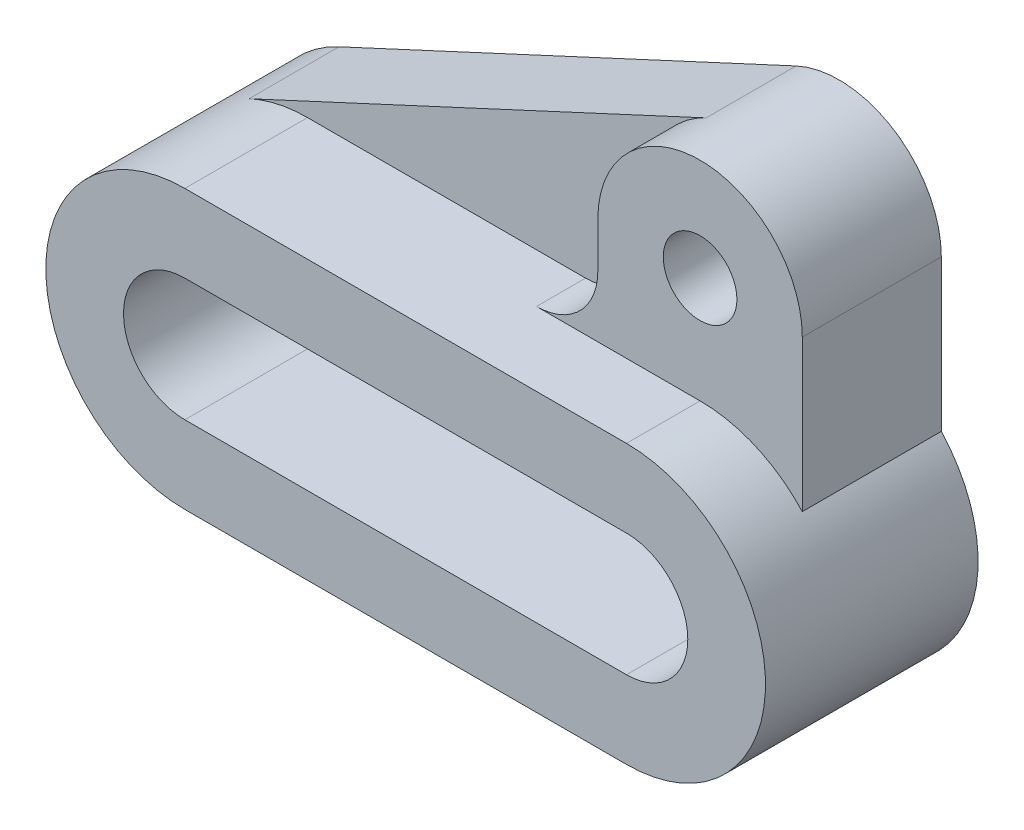
ISO-10303-21;
HEADER;
FILE_DESCRIPTION(('STEP AP214'),'2;1');
FILE_NAME('part.step','',(''),(''),'','','');
FILE_SCHEMA(('AUTOMOTIVE_DESIGN { 1 0 10303 214 1 1 1 1 }'));
ENDSEC;
DATA;
#1=APPLICATION_CONTEXT('core data for automotive mechanical design processes');
#2=APPLICATION_PROTOCOL_DEFINITION('international standard','automotive_design',2000,#1);
#3=PRODUCT_CONTEXT('',#1,'mechanical');
#4=PRODUCT('Part','Part','',(#3));
#5=PRODUCT_RELATED_PRODUCT_CATEGORY('part','',(#4));
#6=PRODUCT_DEFINITION_FORMATION('','',#4);
#7=PRODUCT_DEFINITION_CONTEXT('part definition',#1,'design');
#8=PRODUCT_DEFINITION('design','',#6,#7);
#9=PRODUCT_DEFINITION_SHAPE('','',#8);
#10=(LENGTH_UNIT() NAMED_UNIT(*) SI_UNIT(.MILLI.,.METRE.));
#11=(NAMED_UNIT(*) PLANE_ANGLE_UNIT() SI_UNIT($,.RADIAN.));
#12=(NAMED_UNIT(*) SI_UNIT($,.STERADIAN.) SOLID_ANGLE_UNIT());
#13=UNCERTAINTY_MEASURE_WITH_UNIT(LENGTH_MEASURE(1.E-05),#10,'distance_accuracy_value','');
#14=(GEOMETRIC_REPRESENTATION_CONTEXT(3) GLOBAL_UNCERTAINTY_ASSIGNED_CONTEXT((#13)) GLOBAL_UNIT_ASSIGNED_CONTEXT((#10,
#11,#12)) REPRESENTATION_CONTEXT('',''));
#15=CARTESIAN_POINT('',(0.,0.,0.));
#16=DIRECTION('',(0.,0.,1.));
#17=DIRECTION('',(1.,0.,0.));
#18=AXIS2_PLACEMENT_3D('',#15,#16,#17);
#19=CARTESIAN_POINT('',(-54.,34.,-26.));
#20=DIRECTION('',(0.,1.,0.));
#21=DIRECTION('',(-1.,0.,0.));
#22=AXIS2_PLACEMENT_3D('',#19,#20,#21);
#23=PLANE('',#22);
#24=DIRECTION('',(0.,0.,-1.));
#25=VECTOR('',#24,1.);
#26=CARTESIAN_POINT('',(14.,34.,8.));
#27=LINE('',#26,#25);
#28=CARTESIAN_POINT('',(14.,34.,8.));
#29=VERTEX_POINT('',#28);
#30=CARTESIAN_POINT('',(14.,34.,-4.));
#31=VERTEX_POINT('',#30);
#32=EDGE_CURVE('E193',#29,#31,#27,.T.);
#33=ORIENTED_EDGE('',*,*,#32,.T.);
#34=DIRECTION('',(-1.,0.,0.));
#35=VECTOR('',#34,1.);
#36=CARTESIAN_POINT('',(14.,34.,-4.));
#37=LINE('',#36,#35);
#38=CARTESIAN_POINT('',(-54.,34.,-4.00000000000001));
#39=VERTEX_POINT('',#38);
#40=EDGE_CURVE('E299',#31,#39,#37,.T.);
#41=ORIENTED_EDGE('',*,*,#40,.T.);
#42=DIRECTION('',(0.,0.,1.));
#43=VECTOR('',#42,1.);
#44=CARTESIAN_POINT('',(-54.,34.,-26.));
#45=LINE('',#44,#43);
#46=CARTESIAN_POINT('',(-54.,34.,26.));
#47=VERTEX_POINT('',#46);
#48=EDGE_CURVE('E11',#39,#47,#45,.T.);
#49=ORIENTED_EDGE('',*,*,#48,.T.);
#50=DIRECTION('',(-1.,0.,0.));
#51=VECTOR('',#50,1.);
#52=CARTESIAN_POINT('',(-54.,34.,26.));
#53=LINE('',#52,#51);
#54=CARTESIAN_POINT('',(54.,34.,26.));
#55=VERTEX_POINT('',#54);
#56=EDGE_CURVE('E239',#55,#47,#53,.T.);
#57=ORIENTED_EDGE('',*,*,#56,.F.);
#58=DIRECTION('',(0.,0.,1.));
#59=VECTOR('',#58,1.);
#60=CARTESIAN_POINT('',(54.,34.,-26.));
#61=LINE('',#60,#59);
#62=CARTESIAN_POINT('',(54.,34.,7.99999999999999));
#63=VERTEX_POINT('',#62);
#64=EDGE_CURVE('E55',#63,#55,#61,.T.);
#65=ORIENTED_EDGE('',*,*,#64,.F.);
#66=DIRECTION('',(-1.,0.,0.));
#67=VECTOR('',#66,1.);
#68=CARTESIAN_POINT('',(54.,34.,8.));
#69=LINE('',#68,#67);
#70=EDGE_CURVE('E190',#63,#29,#69,.T.);
#71=ORIENTED_EDGE('',*,*,#70,.T.);
#72=EDGE_LOOP('',(#33,#41,#49,#57,#65,#71));
#73=FACE_BOUND('',#72,.T.);
#74=ADVANCED_FACE('F45',(#73),#23,.T.);
#75=CARTESIAN_POINT('',(-54.,0.,-26.));
#76=DIRECTION('',(0.,0.,1.));
#77=DIRECTION('',(1.,0.,0.));
#78=AXIS2_PLACEMENT_3D('',#75,#76,#77);
#79=CYLINDRICAL_SURFACE('',#78,34.);
#80=CARTESIAN_POINT('',(-54.,0.,-4.));
#81=DIRECTION('',(0.,0.,1.));
#82=DIRECTION('',(-1.,0.,0.));
#83=AXIS2_PLACEMENT_3D('',#80,#81,#82);
#84=CIRCLE('',#83,34.);
#85=CARTESIAN_POINT('',(-68.3028960954962,30.8452129718931,-4.));
#86=VERTEX_POINT('',#85);
#87=EDGE_CURVE('E63',#39,#86,#84,.T.);
#88=ORIENTED_EDGE('',*,*,#87,.T.);
#89=DIRECTION('',(0.,0.,-1.));
#90=VECTOR('',#89,1.);
#91=CARTESIAN_POINT('',(-68.3028960954962,30.8452129718931,-4.));
#92=LINE('',#91,#90);
#93=CARTESIAN_POINT('',(-68.3028960954962,30.8452129718931,-26.));
#94=VERTEX_POINT('',#93);
#95=EDGE_CURVE('E67',#86,#94,#92,.T.);
#96=ORIENTED_EDGE('',*,*,#95,.T.);
#97=CARTESIAN_POINT('',(-54.,0.,-26.));
#98=DIRECTION('',(0.,0.,1.));
#99=DIRECTION('',(1.,0.,0.));
#100=AXIS2_PLACEMENT_3D('',#97,#98,#99);
#101=CIRCLE('',#100,34.);
#102=CARTESIAN_POINT('',(-54.,-34.,-26.));
#103=VERTEX_POINT('',#102);
#104=EDGE_CURVE('E263',#94,#103,#101,.T.);
#105=ORIENTED_EDGE('',*,*,#104,.T.);
#106=DIRECTION('',(0.,0.,1.));
#107=VECTOR('',#106,1.);
#108=CARTESIAN_POINT('',(-54.,-34.,-26.));
#109=LINE('',#108,#107);
#110=CARTESIAN_POINT('',(-54.,-34.,26.));
#111=VERTEX_POINT('',#110);
#112=EDGE_CURVE('E49',#103,#111,#109,.T.);
#113=ORIENTED_EDGE('',*,*,#112,.T.);
#114=CARTESIAN_POINT('',(-54.,0.,26.));
#115=DIRECTION('',(0.,0.,1.));
#116=DIRECTION('',(1.,0.,0.));
#117=AXIS2_PLACEMENT_3D('',#114,#115,#116);
#118=CIRCLE('',#117,34.);
#119=EDGE_CURVE('E227',#47,#111,#118,.T.);
#120=ORIENTED_EDGE('',*,*,#119,.F.);
#121=ORIENTED_EDGE('',*,*,#48,.F.);
#122=EDGE_LOOP('',(#88,#96,#105,#113,#120,#121));
#123=FACE_BOUND('',#122,.T.);
#124=ADVANCED_FACE('F47',(#123),#79,.T.);
#125=CARTESIAN_POINT('',(54.,60.,8.));
#126=DIRECTION('',(0.,0.,-1.));
#127=DIRECTION('',(-1.,0.,0.));
#128=AXIS2_PLACEMENT_3D('',#125,#126,#127);
#129=CYLINDRICAL_SURFACE('',#128,25.);
#130=CARTESIAN_POINT('',(54.,60.,-26.));
#131=DIRECTION('',(0.,0.,-1.));
#132=DIRECTION('',(-1.,0.,0.));
#133=AXIS2_PLACEMENT_3D('',#130,#131,#132);
#134=CIRCLE('',#133,25.);
#135=CARTESIAN_POINT('',(43.4831646356646,82.6803036558037,-26.));
#136=VERTEX_POINT('',#135);
#137=CARTESIAN_POINT('',(79.,60.,-26.));
#138=VERTEX_POINT('',#137);
#139=EDGE_CURVE('E196',#136,#138,#134,.T.);
#140=ORIENTED_EDGE('',*,*,#139,.F.);
#141=DIRECTION('',(0.,0.,-1.));
#142=VECTOR('',#141,1.);
#143=CARTESIAN_POINT('',(43.4831646356646,82.6803036558037,-4.));
#144=LINE('',#143,#142);
#145=CARTESIAN_POINT('',(43.4831646356646,82.6803036558037,-4.));
#146=VERTEX_POINT('',#145);
#147=EDGE_CURVE('E326',#146,#136,#144,.T.);
#148=ORIENTED_EDGE('',*,*,#147,.F.);
#149=CARTESIAN_POINT('',(54.,60.,-4.));
#150=DIRECTION('',(0.,0.,1.));
#151=DIRECTION('',(-1.,0.,0.));
#152=AXIS2_PLACEMENT_3D('',#149,#150,#151);
#153=CIRCLE('',#152,25.);
#154=CARTESIAN_POINT('',(29.,60.,-4.));
#155=VERTEX_POINT('',#154);
#156=EDGE_CURVE('E311',#146,#155,#153,.T.);
#157=ORIENTED_EDGE('',*,*,#156,.T.);
#158=DIRECTION('',(0.,0.,-1.));
#159=VECTOR('',#158,1.);
#160=CARTESIAN_POINT('',(29.,60.,8.));
#161=LINE('',#160,#159);
#162=CARTESIAN_POINT('',(29.,60.,8.));
#163=VERTEX_POINT('',#162);
#164=EDGE_CURVE('E165',#163,#155,#161,.T.);
#165=ORIENTED_EDGE('',*,*,#164,.F.);
#166=CARTESIAN_POINT('',(54.,60.,8.));
#167=DIRECTION('',(0.,0.,-1.));
#168=DIRECTION('',(-1.,0.,0.));
#169=AXIS2_PLACEMENT_3D('',#166,#167,#168);
#170=CIRCLE('',#169,25.);
#171=CARTESIAN_POINT('',(79.,60.,8.));
#172=VERTEX_POINT('',#171);
#173=EDGE_CURVE('E171',#163,#172,#170,.T.);
#174=ORIENTED_EDGE('',*,*,#173,.T.);
#175=DIRECTION('',(0.,0.,-1.));
#176=VECTOR('',#175,1.);
#177=CARTESIAN_POINT('',(79.,60.,8.));
#178=LINE('',#177,#176);
#179=EDGE_CURVE('E154',#172,#138,#178,.T.);
#180=ORIENTED_EDGE('',*,*,#179,.T.);
#181=EDGE_LOOP('',(#140,#148,#157,#165,#174,#180));
#182=FACE_BOUND('',#181,.T.);
#183=ADVANCED_FACE('F176',(#182),#129,.T.);
#184=CARTESIAN_POINT('',(29.,60.,8.));
#185=DIRECTION('',(1.,0.,0.));
#186=DIRECTION('',(0.,0.,-1.));
#187=AXIS2_PLACEMENT_3D('',#184,#185,#186);
#188=PLANE('',#187);
#189=DIRECTION('',(0.,-1.,0.));
#190=VECTOR('',#189,1.);
#191=CARTESIAN_POINT('',(29.,60.,-4.));
#192=LINE('',#191,#190);
#193=CARTESIAN_POINT('',(29.,49.,-4.));
#194=VERTEX_POINT('',#193);
#195=EDGE_CURVE('E319',#155,#194,#192,.T.);
#196=ORIENTED_EDGE('',*,*,#195,.T.);
#197=DIRECTION('',(0.,0.,-1.));
#198=VECTOR('',#197,1.);
#199=CARTESIAN_POINT('',(29.,49.,8.));
#200=LINE('',#199,#198);
#201=CARTESIAN_POINT('',(29.,49.,8.));
#202=VERTEX_POINT('',#201);
#203=EDGE_CURVE('E203',#202,#194,#200,.T.);
#204=ORIENTED_EDGE('',*,*,#203,.F.);
#205=DIRECTION('',(0.,-1.,0.));
#206=VECTOR('',#205,1.);
#207=CARTESIAN_POINT('',(29.,60.,8.));
#208=LINE('',#207,#206);
#209=EDGE_CURVE('E180',#163,#202,#208,.T.);
#210=ORIENTED_EDGE('',*,*,#209,.F.);
#211=ORIENTED_EDGE('',*,*,#164,.T.);
#212=EDGE_LOOP('',(#196,#204,#210,#211));
#213=FACE_BOUND('',#212,.T.);
#214=ADVANCED_FACE('F362',(#213),#188,.F.);
#215=CARTESIAN_POINT('',(14.,49.,8.));
#216=DIRECTION('',(0.,0.,-1.));
#217=DIRECTION('',(-1.,0.,0.));
#218=AXIS2_PLACEMENT_3D('',#215,#216,#217);
#219=CYLINDRICAL_SURFACE('',#218,15.);
#220=CARTESIAN_POINT('',(14.,49.,-4.));
#221=DIRECTION('',(0.,0.,-1.));
#222=DIRECTION('',(-1.,0.,0.));
#223=AXIS2_PLACEMENT_3D('',#220,#221,#222);
#224=CIRCLE('',#223,15.);
#225=EDGE_CURVE('E313',#194,#31,#224,.T.);
#226=ORIENTED_EDGE('',*,*,#225,.T.);
#227=ORIENTED_EDGE('',*,*,#32,.F.);
#228=CARTESIAN_POINT('',(14.,49.,8.));
#229=DIRECTION('',(0.,0.,-1.));
#230=DIRECTION('',(-1.,0.,0.));
#231=AXIS2_PLACEMENT_3D('',#228,#229,#230);
#232=CIRCLE('',#231,15.);
#233=EDGE_CURVE('E183',#202,#29,#232,.T.);
#234=ORIENTED_EDGE('',*,*,#233,.F.);
#235=ORIENTED_EDGE('',*,*,#203,.T.);
#236=EDGE_LOOP('',(#226,#227,#234,#235));
#237=FACE_BOUND('',#236,.T.);
#238=ADVANCED_FACE('F352',(#237),#219,.F.);
#239=CARTESIAN_POINT('',(-54.,0.,-26.));
#240=DIRECTION('',(0.,0.,1.));
#241=DIRECTION('',(1.,0.,0.));
#242=AXIS2_PLACEMENT_3D('',#239,#240,#241);
#243=PLANE('',#242);
#244=ORIENTED_EDGE('',*,*,#104,.F.);
#245=DIRECTION('',(0.907212146232149,0.420673414573416,0.));
#246=VECTOR('',#245,1.);
#247=CARTESIAN_POINT('',(43.4831646356646,82.6803036558037,-26.));
#248=LINE('',#247,#246);
#249=EDGE_CURVE('E322',#94,#136,#248,.T.);
#250=ORIENTED_EDGE('',*,*,#249,.T.);
#251=ORIENTED_EDGE('',*,*,#139,.T.);
#252=DIRECTION('',(0.,-1.,0.));
#253=VECTOR('',#252,1.);
#254=CARTESIAN_POINT('',(79.,60.,-26.));
#255=LINE('',#254,#253);
#256=CARTESIAN_POINT('',(79.,23.0434372436059,-26.));
#257=VERTEX_POINT('',#256);
#258=EDGE_CURVE('E160',#138,#257,#255,.T.);
#259=ORIENTED_EDGE('',*,*,#258,.T.);
#260=CARTESIAN_POINT('',(54.,0.,-26.));
#261=DIRECTION('',(0.,0.,1.));
#262=DIRECTION('',(1.,0.,0.));
#263=AXIS2_PLACEMENT_3D('',#260,#261,#262);
#264=CIRCLE('',#263,34.);
#265=CARTESIAN_POINT('',(54.,-34.,-26.));
#266=VERTEX_POINT('',#265);
#267=EDGE_CURVE('E278',#266,#257,#264,.T.);
#268=ORIENTED_EDGE('',*,*,#267,.F.);
#269=DIRECTION('',(1.,0.,0.));
#270=VECTOR('',#269,1.);
#271=CARTESIAN_POINT('',(-54.,-34.,-26.));
#272=LINE('',#271,#270);
#273=EDGE_CURVE('E274',#103,#266,#272,.T.);
#274=ORIENTED_EDGE('',*,*,#273,.F.);
#275=EDGE_LOOP('',(#244,#250,#251,#259,#268,#274));
#276=FACE_BOUND('',#275,.T.);
#277=DIRECTION('',(-1.,0.,0.));
#278=VECTOR('',#277,1.);
#279=CARTESIAN_POINT('',(-54.,15.,-26.));
#280=LINE('',#279,#278);
#281=CARTESIAN_POINT('',(54.,15.,-26.));
#282=VERTEX_POINT('',#281);
#283=CARTESIAN_POINT('',(-54.,15.,-26.));
#284=VERTEX_POINT('',#283);
#285=EDGE_CURVE('E255',#282,#284,#280,.T.);
#286=ORIENTED_EDGE('',*,*,#285,.T.);
#287=CARTESIAN_POINT('',(-54.,0.,-26.));
#288=DIRECTION('',(0.,0.,1.));
#289=DIRECTION('',(1.,0.,0.));
#290=AXIS2_PLACEMENT_3D('',#287,#288,#289);
#291=CIRCLE('',#290,15.);
#292=CARTESIAN_POINT('',(-54.,-15.,-26.));
#293=VERTEX_POINT('',#292);
#294=EDGE_CURVE('E243',#284,#293,#291,.T.);
#295=ORIENTED_EDGE('',*,*,#294,.T.);
#296=DIRECTION('',(1.,0.,0.));
#297=VECTOR('',#296,1.);
#298=CARTESIAN_POINT('',(-54.,-15.,-26.));
#299=LINE('',#298,#297);
#300=CARTESIAN_POINT('',(54.,-15.,-26.));
#301=VERTEX_POINT('',#300);
#302=EDGE_CURVE('E247',#293,#301,#299,.T.);
#303=ORIENTED_EDGE('',*,*,#302,.T.);
#304=CARTESIAN_POINT('',(54.,0.,-26.));
#305=DIRECTION('',(0.,0.,1.));
#306=DIRECTION('',(1.,0.,0.));
#307=AXIS2_PLACEMENT_3D('',#304,#305,#306);
#308=CIRCLE('',#307,15.);
#309=EDGE_CURVE('E251',#301,#282,#308,.T.);
#310=ORIENTED_EDGE('',*,*,#309,.T.);
#311=EDGE_LOOP('',(#286,#295,#303,#310));
#312=FACE_BOUND('',#311,.T.);
#313=CARTESIAN_POINT('',(54.,60.,-26.));
#314=DIRECTION('',(0.,0.,-1.));
#315=DIRECTION('',(-1.,0.,0.));
#316=AXIS2_PLACEMENT_3D('',#313,#314,#315);
#317=CIRCLE('',#316,9.00000000000001);
#318=CARTESIAN_POINT('',(45.,60.,-26.));
#319=VERTEX_POINT('',#318);
#320=EDGE_CURVE('E330',#319,#319,#317,.T.);
#321=ORIENTED_EDGE('',*,*,#320,.F.);
#322=EDGE_LOOP('',(#321));
#323=FACE_BOUND('',#322,.T.);
#324=ADVANCED_FACE('F349',(#276,#312,#323),#243,.F.);
#325=CARTESIAN_POINT('',(54.,0.,-26.));
#326=DIRECTION('',(0.,0.,1.));
#327=DIRECTION('',(1.,0.,0.));
#328=AXIS2_PLACEMENT_3D('',#325,#326,#327);
#329=CYLINDRICAL_SURFACE('',#328,34.);
#330=DIRECTION('',(0.,0.,-1.));
#331=VECTOR('',#330,1.);
#332=CARTESIAN_POINT('',(79.,23.0434372436059,8.));
#333=LINE('',#332,#331);
#334=CARTESIAN_POINT('',(79.,23.0434372436059,8.));
#335=VERTEX_POINT('',#334);
#336=EDGE_CURVE('E164',#335,#257,#333,.T.);
#337=ORIENTED_EDGE('',*,*,#336,.F.);
#338=CARTESIAN_POINT('',(54.,0.,8.));
#339=DIRECTION('',(0.,0.,-1.));
#340=DIRECTION('',(-1.,0.,0.));
#341=AXIS2_PLACEMENT_3D('',#338,#339,#340);
#342=CIRCLE('',#341,34.);
#343=EDGE_CURVE('E173',#63,#335,#342,.T.);
#344=ORIENTED_EDGE('',*,*,#343,.F.);
#345=ORIENTED_EDGE('',*,*,#64,.T.);
#346=CARTESIAN_POINT('',(54.,0.,26.));
#347=DIRECTION('',(0.,0.,1.));
#348=DIRECTION('',(1.,0.,0.));
#349=AXIS2_PLACEMENT_3D('',#346,#347,#348);
#350=CIRCLE('',#349,34.);
#351=CARTESIAN_POINT('',(54.,-34.,26.));
#352=VERTEX_POINT('',#351);
#353=EDGE_CURVE('E235',#352,#55,#350,.T.);
#354=ORIENTED_EDGE('',*,*,#353,.F.);
#355=DIRECTION('',(0.,0.,1.));
#356=VECTOR('',#355,1.);
#357=CARTESIAN_POINT('',(54.,-34.,-26.));
#358=LINE('',#357,#356);
#359=EDGE_CURVE('E282',#266,#352,#358,.T.);
#360=ORIENTED_EDGE('',*,*,#359,.F.);
#361=ORIENTED_EDGE('',*,*,#267,.T.);
#362=EDGE_LOOP('',(#337,#344,#345,#354,#360,#361));
#363=FACE_BOUND('',#362,.T.);
#364=ADVANCED_FACE('F351',(#363),#329,.T.);
#365=CARTESIAN_POINT('',(-54.,-34.,-26.));
#366=DIRECTION('',(0.,-1.,0.));
#367=DIRECTION('',(1.,0.,0.));
#368=AXIS2_PLACEMENT_3D('',#365,#366,#367);
#369=PLANE('',#368);
#370=ORIENTED_EDGE('',*,*,#359,.T.);
#371=DIRECTION('',(1.,0.,0.));
#372=VECTOR('',#371,1.);
#373=CARTESIAN_POINT('',(-54.,-34.,26.));
#374=LINE('',#373,#372);
#375=EDGE_CURVE('E231',#111,#352,#374,.T.);
#376=ORIENTED_EDGE('',*,*,#375,.F.);
#377=ORIENTED_EDGE('',*,*,#112,.F.);
#378=ORIENTED_EDGE('',*,*,#273,.T.);
#379=EDGE_LOOP('',(#370,#376,#377,#378));
#380=FACE_BOUND('',#379,.T.);
#381=ADVANCED_FACE('F290',(#380),#369,.T.);
#382=CARTESIAN_POINT('',(-54.,0.,-26.));
#383=DIRECTION('',(0.,0.,1.));
#384=DIRECTION('',(1.,0.,0.));
#385=AXIS2_PLACEMENT_3D('',#382,#383,#384);
#386=CYLINDRICAL_SURFACE('',#385,15.);
#387=DIRECTION('',(0.,0.,1.));
#388=VECTOR('',#387,1.);
#389=CARTESIAN_POINT('',(-54.,15.,-26.));
#390=LINE('',#389,#388);
#391=CARTESIAN_POINT('',(-54.,15.,26.));
#392=VERTEX_POINT('',#391);
#393=EDGE_CURVE('E260',#284,#392,#390,.T.);
#394=ORIENTED_EDGE('',*,*,#393,.T.);
#395=CARTESIAN_POINT('',(-54.,0.,26.));
#396=DIRECTION('',(0.,0.,1.));
#397=DIRECTION('',(1.,0.,0.));
#398=AXIS2_PLACEMENT_3D('',#395,#396,#397);
#399=CIRCLE('',#398,15.);
#400=CARTESIAN_POINT('',(-54.,-15.,26.));
#401=VERTEX_POINT('',#400);
#402=EDGE_CURVE('E211',#392,#401,#399,.T.);
#403=ORIENTED_EDGE('',*,*,#402,.T.);
#404=DIRECTION('',(0.,0.,1.));
#405=VECTOR('',#404,1.);
#406=CARTESIAN_POINT('',(-54.,-15.,-26.));
#407=LINE('',#406,#405);
#408=EDGE_CURVE('E259',#293,#401,#407,.T.);
#409=ORIENTED_EDGE('',*,*,#408,.F.);
#410=ORIENTED_EDGE('',*,*,#294,.F.);
#411=EDGE_LOOP('',(#394,#403,#409,#410));
#412=FACE_BOUND('',#411,.T.);
#413=ADVANCED_FACE('F373',(#412),#386,.F.);
#414=CARTESIAN_POINT('',(-54.,15.,-26.));
#415=DIRECTION('',(0.,1.,0.));
#416=DIRECTION('',(-1.,0.,0.));
#417=AXIS2_PLACEMENT_3D('',#414,#415,#416);
#418=PLANE('',#417);
#419=DIRECTION('',(0.,0.,1.));
#420=VECTOR('',#419,1.);
#421=CARTESIAN_POINT('',(54.,15.,-26.));
#422=LINE('',#421,#420);
#423=CARTESIAN_POINT('',(54.,15.,26.));
#424=VERTEX_POINT('',#423);
#425=EDGE_CURVE('E264',#282,#424,#422,.T.);
#426=ORIENTED_EDGE('',*,*,#425,.T.);
#427=DIRECTION('',(-1.,0.,0.));
#428=VECTOR('',#427,1.);
#429=CARTESIAN_POINT('',(-54.,15.,26.));
#430=LINE('',#429,#428);
#431=EDGE_CURVE('E223',#424,#392,#430,.T.);
#432=ORIENTED_EDGE('',*,*,#431,.T.);
#433=ORIENTED_EDGE('',*,*,#393,.F.);
#434=ORIENTED_EDGE('',*,*,#285,.F.);
#435=EDGE_LOOP('',(#426,#432,#433,#434));
#436=FACE_BOUND('',#435,.T.);
#437=ADVANCED_FACE('F377',(#436),#418,.F.);
#438=CARTESIAN_POINT('',(54.,0.,-26.));
#439=DIRECTION('',(0.,0.,1.));
#440=DIRECTION('',(1.,0.,0.));
#441=AXIS2_PLACEMENT_3D('',#438,#439,#440);
#442=CYLINDRICAL_SURFACE('',#441,15.);
#443=DIRECTION('',(0.,0.,1.));
#444=VECTOR('',#443,1.);
#445=CARTESIAN_POINT('',(54.,-15.,-26.));
#446=LINE('',#445,#444);
#447=CARTESIAN_POINT('',(54.,-15.,26.));
#448=VERTEX_POINT('',#447);
#449=EDGE_CURVE('E267',#301,#448,#446,.T.);
#450=ORIENTED_EDGE('',*,*,#449,.T.);
#451=CARTESIAN_POINT('',(54.,0.,26.));
#452=DIRECTION('',(0.,0.,1.));
#453=DIRECTION('',(1.,0.,0.));
#454=AXIS2_PLACEMENT_3D('',#451,#452,#453);
#455=CIRCLE('',#454,15.);
#456=EDGE_CURVE('E219',#448,#424,#455,.T.);
#457=ORIENTED_EDGE('',*,*,#456,.T.);
#458=ORIENTED_EDGE('',*,*,#425,.F.);
#459=ORIENTED_EDGE('',*,*,#309,.F.);
#460=EDGE_LOOP('',(#450,#457,#458,#459));
#461=FACE_BOUND('',#460,.T.);
#462=ADVANCED_FACE('F382',(#461),#442,.F.);
#463=CARTESIAN_POINT('',(-54.,-15.,-26.));
#464=DIRECTION('',(0.,-1.,0.));
#465=DIRECTION('',(1.,0.,0.));
#466=AXIS2_PLACEMENT_3D('',#463,#464,#465);
#467=PLANE('',#466);
#468=ORIENTED_EDGE('',*,*,#408,.T.);
#469=DIRECTION('',(1.,0.,0.));
#470=VECTOR('',#469,1.);
#471=CARTESIAN_POINT('',(-54.,-15.,26.));
#472=LINE('',#471,#470);
#473=EDGE_CURVE('E215',#401,#448,#472,.T.);
#474=ORIENTED_EDGE('',*,*,#473,.T.);
#475=ORIENTED_EDGE('',*,*,#449,.F.);
#476=ORIENTED_EDGE('',*,*,#302,.F.);
#477=EDGE_LOOP('',(#468,#474,#475,#476));
#478=FACE_BOUND('',#477,.T.);
#479=ADVANCED_FACE('F386',(#478),#467,.F.);
#480=CARTESIAN_POINT('',(-54.,0.,26.));
#481=DIRECTION('',(0.,0.,1.));
#482=DIRECTION('',(1.,0.,0.));
#483=AXIS2_PLACEMENT_3D('',#480,#481,#482);
#484=PLANE('',#483);
#485=ORIENTED_EDGE('',*,*,#119,.T.);
#486=ORIENTED_EDGE('',*,*,#375,.T.);
#487=ORIENTED_EDGE('',*,*,#353,.T.);
#488=ORIENTED_EDGE('',*,*,#56,.T.);
#489=EDGE_LOOP('',(#485,#486,#487,#488));
#490=FACE_BOUND('',#489,.T.);
#491=ORIENTED_EDGE('',*,*,#473,.F.);
#492=ORIENTED_EDGE('',*,*,#402,.F.);
#493=ORIENTED_EDGE('',*,*,#431,.F.);
#494=ORIENTED_EDGE('',*,*,#456,.F.);
#495=EDGE_LOOP('',(#491,#492,#493,#494));
#496=FACE_BOUND('',#495,.T.);
#497=ADVANCED_FACE('F293',(#490,#496),#484,.T.);
#498=CARTESIAN_POINT('',(79.,60.,8.));
#499=DIRECTION('',(1.,0.,0.));
#500=DIRECTION('',(0.,0.,-1.));
#501=AXIS2_PLACEMENT_3D('',#498,#499,#500);
#502=PLANE('',#501);
#503=ORIENTED_EDGE('',*,*,#258,.F.);
#504=ORIENTED_EDGE('',*,*,#179,.F.);
#505=DIRECTION('',(0.,-1.,0.));
#506=VECTOR('',#505,1.);
#507=CARTESIAN_POINT('',(79.,60.,8.));
#508=LINE('',#507,#506);
#509=EDGE_CURVE('E158',#172,#335,#508,.T.);
#510=ORIENTED_EDGE('',*,*,#509,.T.);
#511=ORIENTED_EDGE('',*,*,#336,.T.);
#512=EDGE_LOOP('',(#503,#504,#510,#511));
#513=FACE_BOUND('',#512,.T.);
#514=ADVANCED_FACE('F156',(#513),#502,.T.);
#515=CARTESIAN_POINT('',(54.,0.,8.));
#516=DIRECTION('',(0.,0.,-1.));
#517=DIRECTION('',(-1.,0.,0.));
#518=AXIS2_PLACEMENT_3D('',#515,#516,#517);
#519=PLANE('',#518);
#520=CARTESIAN_POINT('',(54.,60.,8.));
#521=DIRECTION('',(0.,0.,-1.));
#522=DIRECTION('',(-1.,0.,0.));
#523=AXIS2_PLACEMENT_3D('',#520,#521,#522);
#524=CIRCLE('',#523,9.00000000000001);
#525=CARTESIAN_POINT('',(45.,60.,8.));
#526=VERTEX_POINT('',#525);
#527=EDGE_CURVE('E197',#526,#526,#524,.T.);
#528=ORIENTED_EDGE('',*,*,#527,.T.);
#529=EDGE_LOOP('',(#528));
#530=FACE_BOUND('',#529,.T.);
#531=ORIENTED_EDGE('',*,*,#343,.T.);
#532=ORIENTED_EDGE('',*,*,#509,.F.);
#533=ORIENTED_EDGE('',*,*,#173,.F.);
#534=ORIENTED_EDGE('',*,*,#209,.T.);
#535=ORIENTED_EDGE('',*,*,#233,.T.);
#536=ORIENTED_EDGE('',*,*,#70,.F.);
#537=EDGE_LOOP('',(#531,#532,#533,#534,#535,#536));
#538=FACE_BOUND('',#537,.T.);
#539=ADVANCED_FACE('F170',(#530,#538),#519,.F.);
#540=CARTESIAN_POINT('',(54.,60.,-26.));
#541=DIRECTION('',(0.,0.,-1.));
#542=DIRECTION('',(-1.,0.,0.));
#543=AXIS2_PLACEMENT_3D('',#540,#541,#542);
#544=CYLINDRICAL_SURFACE('',#543,9.00000000000001);
#545=ORIENTED_EDGE('',*,*,#527,.F.);
#546=EDGE_LOOP('',(#545));
#547=FACE_BOUND('',#546,.T.);
#548=ORIENTED_EDGE('',*,*,#320,.T.);
#549=EDGE_LOOP('',(#548));
#550=FACE_BOUND('',#549,.T.);
#551=ADVANCED_FACE('F342',(#547,#550),#544,.F.);
#552=CARTESIAN_POINT('',(43.4831646356646,82.6803036558037,-4.));
#553=DIRECTION('',(-0.420673414573416,0.907212146232149,0.));
#554=DIRECTION('',(-0.907212146232149,-0.420673414573416,0.));
#555=AXIS2_PLACEMENT_3D('',#552,#553,#554);
#556=PLANE('',#555);
#557=ORIENTED_EDGE('',*,*,#249,.F.);
#558=ORIENTED_EDGE('',*,*,#95,.F.);
#559=DIRECTION('',(0.907212146232149,0.420673414573416,0.));
#560=VECTOR('',#559,1.);
#561=CARTESIAN_POINT('',(43.4831646356646,82.6803036558037,-4.));
#562=LINE('',#561,#560);
#563=EDGE_CURVE('E306',#86,#146,#562,.T.);
#564=ORIENTED_EDGE('',*,*,#563,.T.);
#565=ORIENTED_EDGE('',*,*,#147,.T.);
#566=EDGE_LOOP('',(#557,#558,#564,#565));
#567=FACE_BOUND('',#566,.T.);
#568=ADVANCED_FACE('F345',(#567),#556,.T.);
#569=CARTESIAN_POINT('',(14.,49.,-4.));
#570=DIRECTION('',(0.,0.,-1.));
#571=DIRECTION('',(-1.,0.,0.));
#572=AXIS2_PLACEMENT_3D('',#569,#570,#571);
#573=PLANE('',#572);
#574=ORIENTED_EDGE('',*,*,#225,.F.);
#575=ORIENTED_EDGE('',*,*,#195,.F.);
#576=ORIENTED_EDGE('',*,*,#156,.F.);
#577=ORIENTED_EDGE('',*,*,#563,.F.);
#578=ORIENTED_EDGE('',*,*,#87,.F.);
#579=ORIENTED_EDGE('',*,*,#40,.F.);
#580=EDGE_LOOP('',(#574,#575,#576,#577,#578,#579));
#581=FACE_BOUND('',#580,.T.);
#582=ADVANCED_FACE('F303',(#581),#573,.F.);
#583=CLOSED_SHELL('',(#74,#124,#183,#214,#238,#324,#364,#381,#413,#437,#462,#479,#497,#514,#539,
#551,#568,#582));
#584=MANIFOLD_SOLID_BREP('B2',#583);
#585=ADVANCED_BREP_SHAPE_REPRESENTATION('',(#18,#584),#14);
#586=SHAPE_DEFINITION_REPRESENTATION(#9,#585);
ENDSEC;
END-ISO-10303-21;
